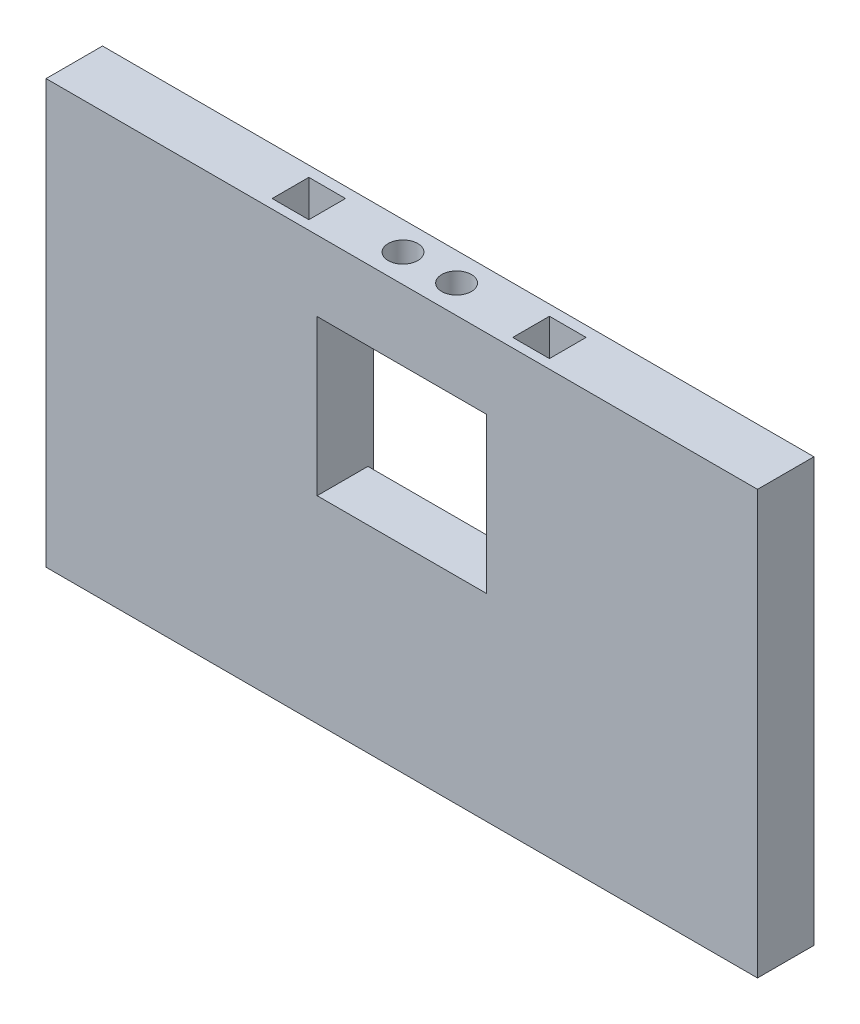
ISO-10303-21;
HEADER;
FILE_DESCRIPTION(('STEP AP214'),'2;1');
FILE_NAME('part.step','',(''),(''),'','','');
FILE_SCHEMA(('AUTOMOTIVE_DESIGN { 1 0 10303 214 1 1 1 1 }'));
ENDSEC;
DATA;
#1=APPLICATION_CONTEXT('core data for automotive mechanical design processes');
#2=APPLICATION_PROTOCOL_DEFINITION('international standard','automotive_design',2000,#1);
#3=PRODUCT_CONTEXT('',#1,'mechanical');
#4=PRODUCT('Part','Part','',(#3));
#5=PRODUCT_RELATED_PRODUCT_CATEGORY('part','',(#4));
#6=PRODUCT_DEFINITION_FORMATION('','',#4);
#7=PRODUCT_DEFINITION_CONTEXT('part definition',#1,'design');
#8=PRODUCT_DEFINITION('design','',#6,#7);
#9=PRODUCT_DEFINITION_SHAPE('','',#8);
#10=(LENGTH_UNIT() NAMED_UNIT(*) SI_UNIT(.MILLI.,.METRE.));
#11=(NAMED_UNIT(*) PLANE_ANGLE_UNIT() SI_UNIT($,.RADIAN.));
#12=(NAMED_UNIT(*) SI_UNIT($,.STERADIAN.) SOLID_ANGLE_UNIT());
#13=UNCERTAINTY_MEASURE_WITH_UNIT(LENGTH_MEASURE(1.E-05),#10,'distance_accuracy_value','');
#14=(GEOMETRIC_REPRESENTATION_CONTEXT(3) GLOBAL_UNCERTAINTY_ASSIGNED_CONTEXT((#13)) GLOBAL_UNIT_ASSIGNED_CONTEXT((#10,
#11,#12)) REPRESENTATION_CONTEXT('',''));
#15=CARTESIAN_POINT('',(0.,0.,0.));
#16=DIRECTION('',(0.,0.,1.));
#17=DIRECTION('',(1.,0.,0.));
#18=AXIS2_PLACEMENT_3D('',#15,#16,#17);
#19=CARTESIAN_POINT('',(0.,0.,0.));
#20=DIRECTION('',(0.,0.,1.));
#21=DIRECTION('',(1.,0.,0.));
#22=AXIS2_PLACEMENT_3D('',#19,#20,#21);
#23=PLANE('',#22);
#24=DIRECTION('',(0.,-1.,0.));
#25=VECTOR('',#24,1.);
#26=CARTESIAN_POINT('',(-86.742581767651,0.,0.));
#27=LINE('',#26,#25);
#28=CARTESIAN_POINT('',(-86.742581767651,64.0903954802261,0.));
#29=VERTEX_POINT('',#28);
#30=CARTESIAN_POINT('',(-86.742581767651,-57.909604519774,0.));
#31=VERTEX_POINT('',#30);
#32=EDGE_CURVE('E11',#29,#31,#27,.T.);
#33=ORIENTED_EDGE('',*,*,#32,.T.);
#34=DIRECTION('',(-1.,0.,0.));
#35=VECTOR('',#34,1.);
#36=CARTESIAN_POINT('',(-182.821386225128,-57.909604519774,0.));
#37=LINE('',#36,#35);
#38=CARTESIAN_POINT('',(-182.821386225128,-57.909604519774,0.));
#39=VERTEX_POINT('',#38);
#40=EDGE_CURVE('E218',#31,#39,#37,.T.);
#41=ORIENTED_EDGE('',*,*,#40,.T.);
#42=DIRECTION('',(0.,-1.,0.));
#43=VECTOR('',#42,1.);
#44=CARTESIAN_POINT('',(-182.821386225128,92.090395480226,0.));
#45=LINE('',#44,#43);
#46=CARTESIAN_POINT('',(-182.821386225128,92.090395480226,0.));
#47=VERTEX_POINT('',#46);
#48=EDGE_CURVE('E295',#47,#39,#45,.T.);
#49=ORIENTED_EDGE('',*,*,#48,.F.);
#50=DIRECTION('',(-1.,0.,0.));
#51=VECTOR('',#50,1.);
#52=CARTESIAN_POINT('',(-107.821386225128,92.090395480226,0.));
#53=LINE('',#52,#51);
#54=CARTESIAN_POINT('',(69.336222689826,92.0903954802261,0.));
#55=VERTEX_POINT('',#54);
#56=EDGE_CURVE('E301',#55,#47,#53,.T.);
#57=ORIENTED_EDGE('',*,*,#56,.F.);
#58=DIRECTION('',(0.,1.,0.));
#59=VECTOR('',#58,1.);
#60=CARTESIAN_POINT('',(69.336222689826,-57.909604519774,0.));
#61=LINE('',#60,#59);
#62=CARTESIAN_POINT('',(69.336222689826,-57.909604519774,0.));
#63=VERTEX_POINT('',#62);
#64=EDGE_CURVE('E208',#63,#55,#61,.T.);
#65=ORIENTED_EDGE('',*,*,#64,.F.);
#66=CARTESIAN_POINT('',(-26.7425817676511,-57.909604519774,0.));
#67=VERTEX_POINT('',#66);
#68=EDGE_CURVE('E219',#63,#67,#37,.T.);
#69=ORIENTED_EDGE('',*,*,#68,.T.);
#70=DIRECTION('',(0.,1.,0.));
#71=VECTOR('',#70,1.);
#72=CARTESIAN_POINT('',(-26.7425817676511,0.,0.));
#73=LINE('',#72,#71);
#74=CARTESIAN_POINT('',(-26.7425817676511,64.0903954802261,0.));
#75=VERTEX_POINT('',#74);
#76=EDGE_CURVE('E160',#67,#75,#73,.T.);
#77=ORIENTED_EDGE('',*,*,#76,.T.);
#78=DIRECTION('',(-1.,0.,0.));
#79=VECTOR('',#78,1.);
#80=CARTESIAN_POINT('',(0.,64.0903954802261,0.));
#81=LINE('',#80,#79);
#82=EDGE_CURVE('E41',#75,#29,#81,.T.);
#83=ORIENTED_EDGE('',*,*,#82,.T.);
#84=EDGE_LOOP('',(#33,#41,#49,#57,#65,#69,#77,#83));
#85=FACE_BOUND('',#84,.T.);
#86=ADVANCED_FACE('F33',(#85),#23,.F.);
#87=CARTESIAN_POINT('',(-182.821386225128,-57.909604519774,-316.865902236261));
#88=DIRECTION('',(0.,-1.,0.));
#89=DIRECTION('',(0.,0.,-1.));
#90=AXIS2_PLACEMENT_3D('',#87,#88,#89);
#91=PLANE('',#90);
#92=ORIENTED_EDGE('',*,*,#40,.F.);
#93=DIRECTION('',(0.,0.,-1.));
#94=VECTOR('',#93,1.);
#95=CARTESIAN_POINT('',(-86.742581767651,-57.909604519774,8.));
#96=LINE('',#95,#94);
#97=CARTESIAN_POINT('',(-86.742581767651,-57.909604519774,8.));
#98=VERTEX_POINT('',#97);
#99=EDGE_CURVE('E173',#98,#31,#96,.T.);
#100=ORIENTED_EDGE('',*,*,#99,.F.);
#101=DIRECTION('',(-1.,0.,0.));
#102=VECTOR('',#101,1.);
#103=CARTESIAN_POINT('',(43.7130780475831,-57.909604519774,8.));
#104=LINE('',#103,#102);
#105=CARTESIAN_POINT('',(-26.7425817676511,-57.909604519774,8.));
#106=VERTEX_POINT('',#105);
#107=EDGE_CURVE('E169',#106,#98,#104,.T.);
#108=ORIENTED_EDGE('',*,*,#107,.F.);
#109=DIRECTION('',(0.,0.,-1.));
#110=VECTOR('',#109,1.);
#111=CARTESIAN_POINT('',(-26.7425817676511,-57.909604519774,8.));
#112=LINE('',#111,#110);
#113=EDGE_CURVE('E157',#106,#67,#112,.T.);
#114=ORIENTED_EDGE('',*,*,#113,.T.);
#115=ORIENTED_EDGE('',*,*,#68,.F.);
#116=DIRECTION('',(0.,0.,1.));
#117=VECTOR('',#116,1.);
#118=CARTESIAN_POINT('',(69.336222689826,-57.909604519774,20.));
#119=LINE('',#118,#117);
#120=CARTESIAN_POINT('',(69.3362226898259,-57.909604519774,20.));
#121=VERTEX_POINT('',#120);
#122=EDGE_CURVE('E203',#63,#121,#119,.T.);
#123=ORIENTED_EDGE('',*,*,#122,.T.);
#124=DIRECTION('',(1.,0.,0.));
#125=VECTOR('',#124,1.);
#126=CARTESIAN_POINT('',(-182.821386225128,-57.909604519774,20.));
#127=LINE('',#126,#125);
#128=CARTESIAN_POINT('',(-182.821386225128,-57.909604519774,20.));
#129=VERTEX_POINT('',#128);
#130=EDGE_CURVE('E210',#129,#121,#127,.T.);
#131=ORIENTED_EDGE('',*,*,#130,.F.);
#132=DIRECTION('',(0.,0.,1.));
#133=VECTOR('',#132,1.);
#134=CARTESIAN_POINT('',(-182.821386225128,-57.909604519774,-316.865902236261));
#135=LINE('',#134,#133);
#136=EDGE_CURVE('E215',#39,#129,#135,.T.);
#137=ORIENTED_EDGE('',*,*,#136,.F.);
#138=EDGE_LOOP('',(#92,#100,#108,#114,#115,#123,#131,#137));
#139=FACE_BOUND('',#138,.T.);
#140=ADVANCED_FACE('F177',(#139),#91,.T.);
#141=CARTESIAN_POINT('',(-26.742581767651,12.0903954802261,-20.));
#142=DIRECTION('',(0.,-1.,0.));
#143=DIRECTION('',(1.,0.,0.));
#144=AXIS2_PLACEMENT_3D('',#141,#142,#143);
#145=PLANE('',#144);
#146=DIRECTION('',(-1.,0.,0.));
#147=VECTOR('',#146,1.);
#148=CARTESIAN_POINT('',(43.7130780475831,12.0903954802261,2.));
#149=LINE('',#148,#147);
#150=CARTESIAN_POINT('',(-26.742581767651,12.0903954802261,2.));
#151=VERTEX_POINT('',#150);
#152=CARTESIAN_POINT('',(-86.742581767651,12.0903954802261,2.));
#153=VERTEX_POINT('',#152);
#154=EDGE_CURVE('E171',#151,#153,#149,.T.);
#155=ORIENTED_EDGE('',*,*,#154,.T.);
#156=DIRECTION('',(0.,0.,1.));
#157=VECTOR('',#156,1.);
#158=CARTESIAN_POINT('',(-86.742581767651,12.090395480226,-20.));
#159=LINE('',#158,#157);
#160=CARTESIAN_POINT('',(-86.742581767651,12.090395480226,20.));
#161=VERTEX_POINT('',#160);
#162=EDGE_CURVE('E56',#153,#161,#159,.T.);
#163=ORIENTED_EDGE('',*,*,#162,.T.);
#164=DIRECTION('',(1.,0.,0.));
#165=VECTOR('',#164,1.);
#166=CARTESIAN_POINT('',(-26.742581767651,12.0903954802261,20.));
#167=LINE('',#166,#165);
#168=CARTESIAN_POINT('',(-26.742581767651,12.0903954802261,20.));
#169=VERTEX_POINT('',#168);
#170=EDGE_CURVE('E191',#161,#169,#167,.T.);
#171=ORIENTED_EDGE('',*,*,#170,.T.);
#172=DIRECTION('',(0.,0.,1.));
#173=VECTOR('',#172,1.);
#174=CARTESIAN_POINT('',(-26.742581767651,12.0903954802261,-20.));
#175=LINE('',#174,#173);
#176=EDGE_CURVE('E199',#151,#169,#175,.T.);
#177=ORIENTED_EDGE('',*,*,#176,.F.);
#178=EDGE_LOOP('',(#155,#163,#171,#177));
#179=FACE_BOUND('',#178,.T.);
#180=ADVANCED_FACE('F352',(#179),#145,.F.);
#181=CARTESIAN_POINT('',(-182.821386225128,92.090395480226,20.));
#182=DIRECTION('',(1.,0.,0.));
#183=DIRECTION('',(0.,0.,-1.));
#184=AXIS2_PLACEMENT_3D('',#181,#182,#183);
#185=PLANE('',#184);
#186=ORIENTED_EDGE('',*,*,#48,.T.);
#187=ORIENTED_EDGE('',*,*,#136,.T.);
#188=DIRECTION('',(0.,-1.,0.));
#189=VECTOR('',#188,1.);
#190=CARTESIAN_POINT('',(-182.821386225128,92.090395480226,20.));
#191=LINE('',#190,#189);
#192=CARTESIAN_POINT('',(-182.821386225128,92.090395480226,20.));
#193=VERTEX_POINT('',#192);
#194=EDGE_CURVE('E300',#193,#129,#191,.T.);
#195=ORIENTED_EDGE('',*,*,#194,.F.);
#196=DIRECTION('',(0.,0.,-1.));
#197=VECTOR('',#196,1.);
#198=CARTESIAN_POINT('',(-182.821386225128,92.090395480226,20.));
#199=LINE('',#198,#197);
#200=EDGE_CURVE('E303',#193,#47,#199,.T.);
#201=ORIENTED_EDGE('',*,*,#200,.T.);
#202=EDGE_LOOP('',(#186,#187,#195,#201));
#203=FACE_BOUND('',#202,.T.);
#204=ADVANCED_FACE('F35',(#203),#185,.F.);
#205=CARTESIAN_POINT('',(-107.821386225128,92.090395480226,20.));
#206=DIRECTION('',(0.,-1.,0.));
#207=DIRECTION('',(1.,0.,0.));
#208=AXIS2_PLACEMENT_3D('',#205,#206,#207);
#209=PLANE('',#208);
#210=DIRECTION('',(-1.,0.,0.));
#211=VECTOR('',#210,1.);
#212=CARTESIAN_POINT('',(-7.66377731017402,92.090395480226,3.75));
#213=LINE('',#212,#211);
#214=CARTESIAN_POINT('',(-7.66377731017402,92.090395480226,3.75));
#215=VERTEX_POINT('',#214);
#216=CARTESIAN_POINT('',(-20.663777310174,92.090395480226,3.75));
#217=VERTEX_POINT('',#216);
#218=EDGE_CURVE('E237',#215,#217,#213,.T.);
#219=ORIENTED_EDGE('',*,*,#218,.F.);
#220=DIRECTION('',(0.,0.,-1.));
#221=VECTOR('',#220,1.);
#222=CARTESIAN_POINT('',(-7.66377731017402,92.090395480226,3.75));
#223=LINE('',#222,#221);
#224=CARTESIAN_POINT('',(-7.66377731017402,92.090395480226,16.75));
#225=VERTEX_POINT('',#224);
#226=EDGE_CURVE('E221',#225,#215,#223,.T.);
#227=ORIENTED_EDGE('',*,*,#226,.F.);
#228=DIRECTION('',(1.,0.,0.));
#229=VECTOR('',#228,1.);
#230=CARTESIAN_POINT('',(-7.66377731017402,92.090395480226,16.75));
#231=LINE('',#230,#229);
#232=CARTESIAN_POINT('',(-20.663777310174,92.090395480226,16.75));
#233=VERTEX_POINT('',#232);
#234=EDGE_CURVE('E226',#233,#225,#231,.T.);
#235=ORIENTED_EDGE('',*,*,#234,.F.);
#236=DIRECTION('',(0.,0.,1.));
#237=VECTOR('',#236,1.);
#238=CARTESIAN_POINT('',(-20.663777310174,92.090395480226,3.75));
#239=LINE('',#238,#237);
#240=EDGE_CURVE('E240',#217,#233,#239,.T.);
#241=ORIENTED_EDGE('',*,*,#240,.F.);
#242=EDGE_LOOP('',(#219,#227,#235,#241));
#243=FACE_BOUND('',#242,.T.);
#244=DIRECTION('',(1.,0.,0.));
#245=VECTOR('',#244,1.);
#246=CARTESIAN_POINT('',(-105.941386225128,92.090395480226,16.75));
#247=LINE('',#246,#245);
#248=CARTESIAN_POINT('',(-105.941386225128,92.090395480226,16.75));
#249=VERTEX_POINT('',#248);
#250=CARTESIAN_POINT('',(-92.9413862251281,92.090395480226,16.75));
#251=VERTEX_POINT('',#250);
#252=EDGE_CURVE('E269',#249,#251,#247,.T.);
#253=ORIENTED_EDGE('',*,*,#252,.F.);
#254=DIRECTION('',(0.,0.,1.));
#255=VECTOR('',#254,1.);
#256=CARTESIAN_POINT('',(-105.941386225128,92.090395480226,3.75));
#257=LINE('',#256,#255);
#258=CARTESIAN_POINT('',(-105.941386225128,92.090395480226,3.75));
#259=VERTEX_POINT('',#258);
#260=EDGE_CURVE('E247',#259,#249,#257,.T.);
#261=ORIENTED_EDGE('',*,*,#260,.F.);
#262=DIRECTION('',(-1.,0.,0.));
#263=VECTOR('',#262,1.);
#264=CARTESIAN_POINT('',(-105.941386225128,92.090395480226,3.75));
#265=LINE('',#264,#263);
#266=CARTESIAN_POINT('',(-92.9413862251281,92.090395480226,3.75));
#267=VERTEX_POINT('',#266);
#268=EDGE_CURVE('E258',#267,#259,#265,.T.);
#269=ORIENTED_EDGE('',*,*,#268,.F.);
#270=DIRECTION('',(0.,0.,-1.));
#271=VECTOR('',#270,1.);
#272=CARTESIAN_POINT('',(-92.9413862251281,92.090395480226,3.75));
#273=LINE('',#272,#271);
#274=EDGE_CURVE('E272',#251,#267,#273,.T.);
#275=ORIENTED_EDGE('',*,*,#274,.F.);
#276=EDGE_LOOP('',(#253,#261,#269,#275));
#277=FACE_BOUND('',#276,.T.);
#278=CARTESIAN_POINT('',(-47.3213862251281,92.090395480226,10.));
#279=DIRECTION('',(0.,1.,0.));
#280=DIRECTION('',(-1.,0.,0.));
#281=AXIS2_PLACEMENT_3D('',#278,#279,#280);
#282=CIRCLE('',#281,5.25);
#283=CARTESIAN_POINT('',(-52.5713862251281,92.090395480226,10.));
#284=VERTEX_POINT('',#283);
#285=EDGE_CURVE('E279',#284,#284,#282,.T.);
#286=ORIENTED_EDGE('',*,*,#285,.F.);
#287=EDGE_LOOP('',(#286));
#288=FACE_BOUND('',#287,.T.);
#289=CARTESIAN_POINT('',(-66.3213862251281,92.090395480226,10.));
#290=DIRECTION('',(0.,1.,0.));
#291=DIRECTION('',(-1.,0.,0.));
#292=AXIS2_PLACEMENT_3D('',#289,#290,#291);
#293=CIRCLE('',#292,5.25);
#294=CARTESIAN_POINT('',(-71.5713862251281,92.090395480226,10.));
#295=VERTEX_POINT('',#294);
#296=EDGE_CURVE('E289',#295,#295,#293,.T.);
#297=ORIENTED_EDGE('',*,*,#296,.F.);
#298=EDGE_LOOP('',(#297));
#299=FACE_BOUND('',#298,.T.);
#300=DIRECTION('',(-1.,0.,0.));
#301=VECTOR('',#300,1.);
#302=CARTESIAN_POINT('',(-107.821386225128,92.090395480226,20.));
#303=LINE('',#302,#301);
#304=CARTESIAN_POINT('',(69.336222689826,92.0903954802261,20.));
#305=VERTEX_POINT('',#304);
#306=EDGE_CURVE('E298',#305,#193,#303,.T.);
#307=ORIENTED_EDGE('',*,*,#306,.F.);
#308=DIRECTION('',(0.,0.,1.));
#309=VECTOR('',#308,1.);
#310=CARTESIAN_POINT('',(69.336222689826,92.0903954802261,20.));
#311=LINE('',#310,#309);
#312=EDGE_CURVE('E201',#55,#305,#311,.T.);
#313=ORIENTED_EDGE('',*,*,#312,.F.);
#314=ORIENTED_EDGE('',*,*,#56,.T.);
#315=ORIENTED_EDGE('',*,*,#200,.F.);
#316=EDGE_LOOP('',(#307,#313,#314,#315));
#317=FACE_BOUND('',#316,.T.);
#318=ADVANCED_FACE('F327',(#243,#277,#288,#299,#317),#209,.F.);
#319=CARTESIAN_POINT('',(0.,0.,20.));
#320=DIRECTION('',(0.,0.,1.));
#321=DIRECTION('',(1.,0.,0.));
#322=AXIS2_PLACEMENT_3D('',#319,#320,#321);
#323=PLANE('',#322);
#324=DIRECTION('',(0.,-1.,0.));
#325=VECTOR('',#324,1.);
#326=CARTESIAN_POINT('',(-86.742581767651,62.090395480226,20.));
#327=LINE('',#326,#325);
#328=CARTESIAN_POINT('',(-86.742581767651,67.090395480226,20.));
#329=VERTEX_POINT('',#328);
#330=EDGE_CURVE('E197',#329,#161,#327,.T.);
#331=ORIENTED_EDGE('',*,*,#330,.F.);
#332=DIRECTION('',(-1.,0.,0.));
#333=VECTOR('',#332,1.);
#334=CARTESIAN_POINT('',(-6.51883335149438,67.090395480226,20.));
#335=LINE('',#334,#333);
#336=CARTESIAN_POINT('',(-26.7425817676511,67.090395480226,20.));
#337=VERTEX_POINT('',#336);
#338=EDGE_CURVE('E165',#337,#329,#335,.T.);
#339=ORIENTED_EDGE('',*,*,#338,.F.);
#340=DIRECTION('',(0.,1.,0.));
#341=VECTOR('',#340,1.);
#342=CARTESIAN_POINT('',(-26.7425817676511,62.090395480226,20.));
#343=LINE('',#342,#341);
#344=EDGE_CURVE('E195',#169,#337,#343,.T.);
#345=ORIENTED_EDGE('',*,*,#344,.F.);
#346=ORIENTED_EDGE('',*,*,#170,.F.);
#347=EDGE_LOOP('',(#331,#339,#345,#346));
#348=FACE_BOUND('',#347,.T.);
#349=DIRECTION('',(0.,1.,0.));
#350=VECTOR('',#349,1.);
#351=CARTESIAN_POINT('',(69.336222689826,-57.909604519774,20.));
#352=LINE('',#351,#350);
#353=EDGE_CURVE('E206',#121,#305,#352,.T.);
#354=ORIENTED_EDGE('',*,*,#353,.T.);
#355=ORIENTED_EDGE('',*,*,#306,.T.);
#356=ORIENTED_EDGE('',*,*,#194,.T.);
#357=ORIENTED_EDGE('',*,*,#130,.T.);
#358=EDGE_LOOP('',(#354,#355,#356,#357));
#359=FACE_BOUND('',#358,.T.);
#360=ADVANCED_FACE('F332',(#348,#359),#323,.T.);
#361=CARTESIAN_POINT('',(-66.3213862251281,72.090395480226,10.));
#362=DIRECTION('',(0.,1.,0.));
#363=DIRECTION('',(-1.,0.,0.));
#364=AXIS2_PLACEMENT_3D('',#361,#362,#363);
#365=CYLINDRICAL_SURFACE('',#364,5.25);
#366=CARTESIAN_POINT('',(-66.3213862251281,72.090395480226,10.));
#367=DIRECTION('',(0.,1.,0.));
#368=DIRECTION('',(-1.,0.,0.));
#369=AXIS2_PLACEMENT_3D('',#366,#367,#368);
#370=CIRCLE('',#369,5.25);
#371=CARTESIAN_POINT('',(-71.5713862251281,72.090395480226,10.));
#372=VERTEX_POINT('',#371);
#373=EDGE_CURVE('E292',#372,#372,#370,.T.);
#374=ORIENTED_EDGE('',*,*,#373,.F.);
#375=EDGE_LOOP('',(#374));
#376=FACE_BOUND('',#375,.T.);
#377=ORIENTED_EDGE('',*,*,#296,.T.);
#378=EDGE_LOOP('',(#377));
#379=FACE_BOUND('',#378,.T.);
#380=ADVANCED_FACE('F361',(#376,#379),#365,.F.);
#381=CARTESIAN_POINT('',(-66.3213862251281,72.090395480226,10.));
#382=DIRECTION('',(0.,1.,0.));
#383=DIRECTION('',(-1.,0.,0.));
#384=AXIS2_PLACEMENT_3D('',#381,#382,#383);
#385=PLANE('',#384);
#386=ORIENTED_EDGE('',*,*,#373,.T.);
#387=EDGE_LOOP('',(#386));
#388=FACE_BOUND('',#387,.T.);
#389=ADVANCED_FACE('F376',(#388),#385,.T.);
#390=CARTESIAN_POINT('',(-47.3213862251281,72.090395480226,10.));
#391=DIRECTION('',(0.,1.,0.));
#392=DIRECTION('',(-1.,0.,0.));
#393=AXIS2_PLACEMENT_3D('',#390,#391,#392);
#394=CYLINDRICAL_SURFACE('',#393,5.25);
#395=CARTESIAN_POINT('',(-47.3213862251281,72.090395480226,10.));
#396=DIRECTION('',(0.,1.,0.));
#397=DIRECTION('',(-1.,0.,0.));
#398=AXIS2_PLACEMENT_3D('',#395,#396,#397);
#399=CIRCLE('',#398,5.25);
#400=CARTESIAN_POINT('',(-52.5713862251281,72.090395480226,10.));
#401=VERTEX_POINT('',#400);
#402=EDGE_CURVE('E286',#401,#401,#399,.T.);
#403=ORIENTED_EDGE('',*,*,#402,.F.);
#404=EDGE_LOOP('',(#403));
#405=FACE_BOUND('',#404,.T.);
#406=ORIENTED_EDGE('',*,*,#285,.T.);
#407=EDGE_LOOP('',(#406));
#408=FACE_BOUND('',#407,.T.);
#409=ADVANCED_FACE('F381',(#405,#408),#394,.F.);
#410=CARTESIAN_POINT('',(-47.3213862251281,72.090395480226,10.));
#411=DIRECTION('',(0.,1.,0.));
#412=DIRECTION('',(-1.,0.,0.));
#413=AXIS2_PLACEMENT_3D('',#410,#411,#412);
#414=PLANE('',#413);
#415=ORIENTED_EDGE('',*,*,#402,.T.);
#416=EDGE_LOOP('',(#415));
#417=FACE_BOUND('',#416,.T.);
#418=ADVANCED_FACE('F388',(#417),#414,.T.);
#419=CARTESIAN_POINT('',(-105.941386225128,76.590395480226,3.75));
#420=DIRECTION('',(-1.,0.,0.));
#421=DIRECTION('',(0.,-1.,0.));
#422=AXIS2_PLACEMENT_3D('',#419,#420,#421);
#423=PLANE('',#422);
#424=ORIENTED_EDGE('',*,*,#260,.T.);
#425=DIRECTION('',(0.,1.,0.));
#426=VECTOR('',#425,1.);
#427=CARTESIAN_POINT('',(-105.941386225128,76.590395480226,16.75));
#428=LINE('',#427,#426);
#429=CARTESIAN_POINT('',(-105.941386225128,76.590395480226,16.75));
#430=VERTEX_POINT('',#429);
#431=EDGE_CURVE('E267',#430,#249,#428,.T.);
#432=ORIENTED_EDGE('',*,*,#431,.F.);
#433=DIRECTION('',(0.,0.,1.));
#434=VECTOR('',#433,1.);
#435=CARTESIAN_POINT('',(-105.941386225128,76.590395480226,3.75));
#436=LINE('',#435,#434);
#437=CARTESIAN_POINT('',(-105.941386225128,76.590395480226,3.75));
#438=VERTEX_POINT('',#437);
#439=EDGE_CURVE('E254',#438,#430,#436,.T.);
#440=ORIENTED_EDGE('',*,*,#439,.F.);
#441=DIRECTION('',(0.,1.,0.));
#442=VECTOR('',#441,1.);
#443=CARTESIAN_POINT('',(-105.941386225128,76.590395480226,3.75));
#444=LINE('',#443,#442);
#445=EDGE_CURVE('E277',#438,#259,#444,.T.);
#446=ORIENTED_EDGE('',*,*,#445,.T.);
#447=EDGE_LOOP('',(#424,#432,#440,#446));
#448=FACE_BOUND('',#447,.T.);
#449=ADVANCED_FACE('F392',(#448),#423,.F.);
#450=CARTESIAN_POINT('',(-105.941386225128,76.590395480226,3.75));
#451=DIRECTION('',(0.,0.,-1.));
#452=DIRECTION('',(-1.,0.,0.));
#453=AXIS2_PLACEMENT_3D('',#450,#451,#452);
#454=PLANE('',#453);
#455=ORIENTED_EDGE('',*,*,#268,.T.);
#456=ORIENTED_EDGE('',*,*,#445,.F.);
#457=DIRECTION('',(-1.,0.,0.));
#458=VECTOR('',#457,1.);
#459=CARTESIAN_POINT('',(-105.941386225128,76.590395480226,3.75));
#460=LINE('',#459,#458);
#461=CARTESIAN_POINT('',(-92.9413862251281,76.590395480226,3.75));
#462=VERTEX_POINT('',#461);
#463=EDGE_CURVE('E264',#462,#438,#460,.T.);
#464=ORIENTED_EDGE('',*,*,#463,.F.);
#465=DIRECTION('',(0.,1.,0.));
#466=VECTOR('',#465,1.);
#467=CARTESIAN_POINT('',(-92.9413862251281,76.590395480226,3.75));
#468=LINE('',#467,#466);
#469=EDGE_CURVE('E280',#462,#267,#468,.T.);
#470=ORIENTED_EDGE('',*,*,#469,.T.);
#471=EDGE_LOOP('',(#455,#456,#464,#470));
#472=FACE_BOUND('',#471,.T.);
#473=ADVANCED_FACE('F396',(#472),#454,.F.);
#474=CARTESIAN_POINT('',(-92.9413862251281,76.590395480226,3.75));
#475=DIRECTION('',(1.,0.,0.));
#476=DIRECTION('',(0.,1.,0.));
#477=AXIS2_PLACEMENT_3D('',#474,#475,#476);
#478=PLANE('',#477);
#479=ORIENTED_EDGE('',*,*,#274,.T.);
#480=ORIENTED_EDGE('',*,*,#469,.F.);
#481=DIRECTION('',(0.,0.,-1.));
#482=VECTOR('',#481,1.);
#483=CARTESIAN_POINT('',(-92.9413862251281,76.590395480226,3.75));
#484=LINE('',#483,#482);
#485=CARTESIAN_POINT('',(-92.9413862251281,76.590395480226,16.75));
#486=VERTEX_POINT('',#485);
#487=EDGE_CURVE('E261',#486,#462,#484,.T.);
#488=ORIENTED_EDGE('',*,*,#487,.F.);
#489=DIRECTION('',(0.,1.,0.));
#490=VECTOR('',#489,1.);
#491=CARTESIAN_POINT('',(-92.9413862251281,76.590395480226,16.75));
#492=LINE('',#491,#490);
#493=EDGE_CURVE('E282',#486,#251,#492,.T.);
#494=ORIENTED_EDGE('',*,*,#493,.T.);
#495=EDGE_LOOP('',(#479,#480,#488,#494));
#496=FACE_BOUND('',#495,.T.);
#497=ADVANCED_FACE('F402',(#496),#478,.F.);
#498=CARTESIAN_POINT('',(-105.941386225128,76.590395480226,16.75));
#499=DIRECTION('',(0.,0.,1.));
#500=DIRECTION('',(1.,0.,0.));
#501=AXIS2_PLACEMENT_3D('',#498,#499,#500);
#502=PLANE('',#501);
#503=ORIENTED_EDGE('',*,*,#252,.T.);
#504=ORIENTED_EDGE('',*,*,#493,.F.);
#505=DIRECTION('',(1.,0.,0.));
#506=VECTOR('',#505,1.);
#507=CARTESIAN_POINT('',(-105.941386225128,76.590395480226,16.75));
#508=LINE('',#507,#506);
#509=EDGE_CURVE('E257',#430,#486,#508,.T.);
#510=ORIENTED_EDGE('',*,*,#509,.F.);
#511=ORIENTED_EDGE('',*,*,#431,.T.);
#512=EDGE_LOOP('',(#503,#504,#510,#511));
#513=FACE_BOUND('',#512,.T.);
#514=ADVANCED_FACE('F398',(#513),#502,.F.);
#515=CARTESIAN_POINT('',(0.,76.590395480226,0.));
#516=DIRECTION('',(0.,1.,0.));
#517=DIRECTION('',(0.,0.,1.));
#518=AXIS2_PLACEMENT_3D('',#515,#516,#517);
#519=PLANE('',#518);
#520=ORIENTED_EDGE('',*,*,#439,.T.);
#521=ORIENTED_EDGE('',*,*,#509,.T.);
#522=ORIENTED_EDGE('',*,*,#487,.T.);
#523=ORIENTED_EDGE('',*,*,#463,.T.);
#524=EDGE_LOOP('',(#520,#521,#522,#523));
#525=FACE_BOUND('',#524,.T.);
#526=ADVANCED_FACE('F401',(#525),#519,.T.);
#527=CARTESIAN_POINT('',(-7.66377731017401,76.590395480226,3.75));
#528=DIRECTION('',(1.,0.,0.));
#529=DIRECTION('',(0.,1.,0.));
#530=AXIS2_PLACEMENT_3D('',#527,#528,#529);
#531=PLANE('',#530);
#532=ORIENTED_EDGE('',*,*,#226,.T.);
#533=DIRECTION('',(0.,1.,0.));
#534=VECTOR('',#533,1.);
#535=CARTESIAN_POINT('',(-7.66377731017401,76.590395480226,3.75));
#536=LINE('',#535,#534);
#537=CARTESIAN_POINT('',(-7.66377731017401,76.590395480226,3.75));
#538=VERTEX_POINT('',#537);
#539=EDGE_CURVE('E235',#538,#215,#536,.T.);
#540=ORIENTED_EDGE('',*,*,#539,.F.);
#541=DIRECTION('',(0.,0.,-1.));
#542=VECTOR('',#541,1.);
#543=CARTESIAN_POINT('',(-7.66377731017401,76.590395480226,3.75));
#544=LINE('',#543,#542);
#545=CARTESIAN_POINT('',(-7.66377731017401,76.590395480226,16.75));
#546=VERTEX_POINT('',#545);
#547=EDGE_CURVE('E222',#546,#538,#544,.T.);
#548=ORIENTED_EDGE('',*,*,#547,.F.);
#549=DIRECTION('',(0.,1.,0.));
#550=VECTOR('',#549,1.);
#551=CARTESIAN_POINT('',(-7.66377731017401,76.590395480226,16.75));
#552=LINE('',#551,#550);
#553=EDGE_CURVE('E245',#546,#225,#552,.T.);
#554=ORIENTED_EDGE('',*,*,#553,.T.);
#555=EDGE_LOOP('',(#532,#540,#548,#554));
#556=FACE_BOUND('',#555,.T.);
#557=ADVANCED_FACE('F412',(#556),#531,.F.);
#558=CARTESIAN_POINT('',(-7.66377731017401,76.590395480226,16.75));
#559=DIRECTION('',(0.,0.,1.));
#560=DIRECTION('',(1.,0.,0.));
#561=AXIS2_PLACEMENT_3D('',#558,#559,#560);
#562=PLANE('',#561);
#563=ORIENTED_EDGE('',*,*,#234,.T.);
#564=ORIENTED_EDGE('',*,*,#553,.F.);
#565=DIRECTION('',(1.,0.,0.));
#566=VECTOR('',#565,1.);
#567=CARTESIAN_POINT('',(-7.66377731017401,76.590395480226,16.75));
#568=LINE('',#567,#566);
#569=CARTESIAN_POINT('',(-20.663777310174,76.590395480226,16.75));
#570=VERTEX_POINT('',#569);
#571=EDGE_CURVE('E232',#570,#546,#568,.T.);
#572=ORIENTED_EDGE('',*,*,#571,.F.);
#573=DIRECTION('',(0.,1.,0.));
#574=VECTOR('',#573,1.);
#575=CARTESIAN_POINT('',(-20.663777310174,76.590395480226,16.75));
#576=LINE('',#575,#574);
#577=EDGE_CURVE('E248',#570,#233,#576,.T.);
#578=ORIENTED_EDGE('',*,*,#577,.T.);
#579=EDGE_LOOP('',(#563,#564,#572,#578));
#580=FACE_BOUND('',#579,.T.);
#581=ADVANCED_FACE('F416',(#580),#562,.F.);
#582=CARTESIAN_POINT('',(-20.663777310174,76.590395480226,3.75));
#583=DIRECTION('',(-1.,0.,0.));
#584=DIRECTION('',(0.,-1.,0.));
#585=AXIS2_PLACEMENT_3D('',#582,#583,#584);
#586=PLANE('',#585);
#587=ORIENTED_EDGE('',*,*,#240,.T.);
#588=ORIENTED_EDGE('',*,*,#577,.F.);
#589=DIRECTION('',(0.,0.,1.));
#590=VECTOR('',#589,1.);
#591=CARTESIAN_POINT('',(-20.663777310174,76.590395480226,3.75));
#592=LINE('',#591,#590);
#593=CARTESIAN_POINT('',(-20.663777310174,76.590395480226,3.75));
#594=VERTEX_POINT('',#593);
#595=EDGE_CURVE('E229',#594,#570,#592,.T.);
#596=ORIENTED_EDGE('',*,*,#595,.F.);
#597=DIRECTION('',(0.,1.,0.));
#598=VECTOR('',#597,1.);
#599=CARTESIAN_POINT('',(-20.663777310174,76.590395480226,3.75));
#600=LINE('',#599,#598);
#601=EDGE_CURVE('E250',#594,#217,#600,.T.);
#602=ORIENTED_EDGE('',*,*,#601,.T.);
#603=EDGE_LOOP('',(#587,#588,#596,#602));
#604=FACE_BOUND('',#603,.T.);
#605=ADVANCED_FACE('F420',(#604),#586,.F.);
#606=CARTESIAN_POINT('',(-7.66377731017401,76.590395480226,3.75));
#607=DIRECTION('',(0.,0.,-1.));
#608=DIRECTION('',(-1.,0.,0.));
#609=AXIS2_PLACEMENT_3D('',#606,#607,#608);
#610=PLANE('',#609);
#611=ORIENTED_EDGE('',*,*,#218,.T.);
#612=ORIENTED_EDGE('',*,*,#601,.F.);
#613=DIRECTION('',(-1.,0.,0.));
#614=VECTOR('',#613,1.);
#615=CARTESIAN_POINT('',(-7.66377731017401,76.590395480226,3.75));
#616=LINE('',#615,#614);
#617=EDGE_CURVE('E225',#538,#594,#616,.T.);
#618=ORIENTED_EDGE('',*,*,#617,.F.);
#619=ORIENTED_EDGE('',*,*,#539,.T.);
#620=EDGE_LOOP('',(#611,#612,#618,#619));
#621=FACE_BOUND('',#620,.T.);
#622=ADVANCED_FACE('F342',(#621),#610,.F.);
#623=CARTESIAN_POINT('',(0.,76.590395480226,0.));
#624=DIRECTION('',(0.,-1.,0.));
#625=DIRECTION('',(0.,0.,-1.));
#626=AXIS2_PLACEMENT_3D('',#623,#624,#625);
#627=PLANE('',#626);
#628=ORIENTED_EDGE('',*,*,#547,.T.);
#629=ORIENTED_EDGE('',*,*,#617,.T.);
#630=ORIENTED_EDGE('',*,*,#595,.T.);
#631=ORIENTED_EDGE('',*,*,#571,.T.);
#632=EDGE_LOOP('',(#628,#629,#630,#631));
#633=FACE_BOUND('',#632,.T.);
#634=ADVANCED_FACE('F335',(#633),#627,.F.);
#635=CARTESIAN_POINT('',(69.336222689826,-57.909604519774,20.));
#636=DIRECTION('',(-1.,0.,0.));
#637=DIRECTION('',(0.,-1.,0.));
#638=AXIS2_PLACEMENT_3D('',#635,#636,#637);
#639=PLANE('',#638);
#640=ORIENTED_EDGE('',*,*,#312,.T.);
#641=ORIENTED_EDGE('',*,*,#353,.F.);
#642=ORIENTED_EDGE('',*,*,#122,.F.);
#643=ORIENTED_EDGE('',*,*,#64,.T.);
#644=EDGE_LOOP('',(#640,#641,#642,#643));
#645=FACE_BOUND('',#644,.T.);
#646=ADVANCED_FACE('F333',(#645),#639,.F.);
#647=CARTESIAN_POINT('',(-86.742581767651,62.090395480226,-20.));
#648=DIRECTION('',(-1.,0.,0.));
#649=DIRECTION('',(0.,0.,1.));
#650=AXIS2_PLACEMENT_3D('',#647,#648,#649);
#651=PLANE('',#650);
#652=ORIENTED_EDGE('',*,*,#32,.F.);
#653=DIRECTION('',(0.,0.148340452930244,0.988936352868298));
#654=VECTOR('',#653,1.);
#655=CARTESIAN_POINT('',(-86.742581767651,64.0903954802261,0.));
#656=LINE('',#655,#654);
#657=EDGE_CURVE('E185',#29,#329,#656,.T.);
#658=ORIENTED_EDGE('',*,*,#657,.T.);
#659=ORIENTED_EDGE('',*,*,#330,.T.);
#660=ORIENTED_EDGE('',*,*,#162,.F.);
#661=DIRECTION('',(0.,-0.996346649041751,0.0854011413464358));
#662=VECTOR('',#661,1.);
#663=CARTESIAN_POINT('',(-86.742581767651,12.0903954802261,2.));
#664=LINE('',#663,#662);
#665=EDGE_CURVE('E179',#153,#98,#664,.T.);
#666=ORIENTED_EDGE('',*,*,#665,.T.);
#667=ORIENTED_EDGE('',*,*,#99,.T.);
#668=EDGE_LOOP('',(#652,#658,#659,#660,#666,#667));
#669=FACE_BOUND('',#668,.T.);
#670=ADVANCED_FACE('F317',(#669),#651,.F.);
#671=CARTESIAN_POINT('',(-26.7425817676511,62.090395480226,-20.));
#672=DIRECTION('',(1.,0.,0.));
#673=DIRECTION('',(0.,0.,-1.));
#674=AXIS2_PLACEMENT_3D('',#671,#672,#673);
#675=PLANE('',#674);
#676=ORIENTED_EDGE('',*,*,#76,.F.);
#677=ORIENTED_EDGE('',*,*,#113,.F.);
#678=DIRECTION('',(0.,-0.996346649041751,0.0854011413464358));
#679=VECTOR('',#678,1.);
#680=CARTESIAN_POINT('',(-26.7425817676511,12.0903954802261,2.));
#681=LINE('',#680,#679);
#682=EDGE_CURVE('E48',#151,#106,#681,.T.);
#683=ORIENTED_EDGE('',*,*,#682,.F.);
#684=ORIENTED_EDGE('',*,*,#176,.T.);
#685=ORIENTED_EDGE('',*,*,#344,.T.);
#686=DIRECTION('',(0.,0.148340452930244,0.988936352868298));
#687=VECTOR('',#686,1.);
#688=CARTESIAN_POINT('',(-26.7425817676511,64.0903954802261,0.));
#689=LINE('',#688,#687);
#690=EDGE_CURVE('E188',#75,#337,#689,.T.);
#691=ORIENTED_EDGE('',*,*,#690,.F.);
#692=EDGE_LOOP('',(#676,#677,#683,#684,#685,#691));
#693=FACE_BOUND('',#692,.T.);
#694=ADVANCED_FACE('F158',(#693),#675,.F.);
#695=CARTESIAN_POINT('',(-6.51883335149438,64.0903954802261,0.));
#696=DIRECTION('',(0.,-0.988936352868298,0.148340452930244));
#697=DIRECTION('',(0.,-0.148340452930244,-0.988936352868298));
#698=AXIS2_PLACEMENT_3D('',#695,#696,#697);
#699=PLANE('',#698);
#700=ORIENTED_EDGE('',*,*,#690,.T.);
#701=ORIENTED_EDGE('',*,*,#338,.T.);
#702=ORIENTED_EDGE('',*,*,#657,.F.);
#703=ORIENTED_EDGE('',*,*,#82,.F.);
#704=EDGE_LOOP('',(#700,#701,#702,#703));
#705=FACE_BOUND('',#704,.T.);
#706=ADVANCED_FACE('F314',(#705),#699,.T.);
#707=CARTESIAN_POINT('',(43.7130780475831,12.0903954802261,2.));
#708=DIRECTION('',(0.,-0.0854011413464358,-0.996346649041751));
#709=DIRECTION('',(0.,0.996346649041751,-0.0854011413464358));
#710=AXIS2_PLACEMENT_3D('',#707,#708,#709);
#711=PLANE('',#710);
#712=ORIENTED_EDGE('',*,*,#682,.T.);
#713=ORIENTED_EDGE('',*,*,#107,.T.);
#714=ORIENTED_EDGE('',*,*,#665,.F.);
#715=ORIENTED_EDGE('',*,*,#154,.F.);
#716=EDGE_LOOP('',(#712,#713,#714,#715));
#717=FACE_BOUND('',#716,.T.);
#718=ADVANCED_FACE('F168',(#717),#711,.T.);
#719=CLOSED_SHELL('',(#86,#140,#180,#204,#318,#360,#380,#389,#409,#418,#449,#473,#497,#514,#526,
#557,#581,#605,#622,#634,#646,#670,#694,#706,#718));
#720=MANIFOLD_SOLID_BREP('B2',#719);
#721=ADVANCED_BREP_SHAPE_REPRESENTATION('',(#18,#720),#14);
#722=SHAPE_DEFINITION_REPRESENTATION(#9,#721);
ENDSEC;
END-ISO-10303-21;
